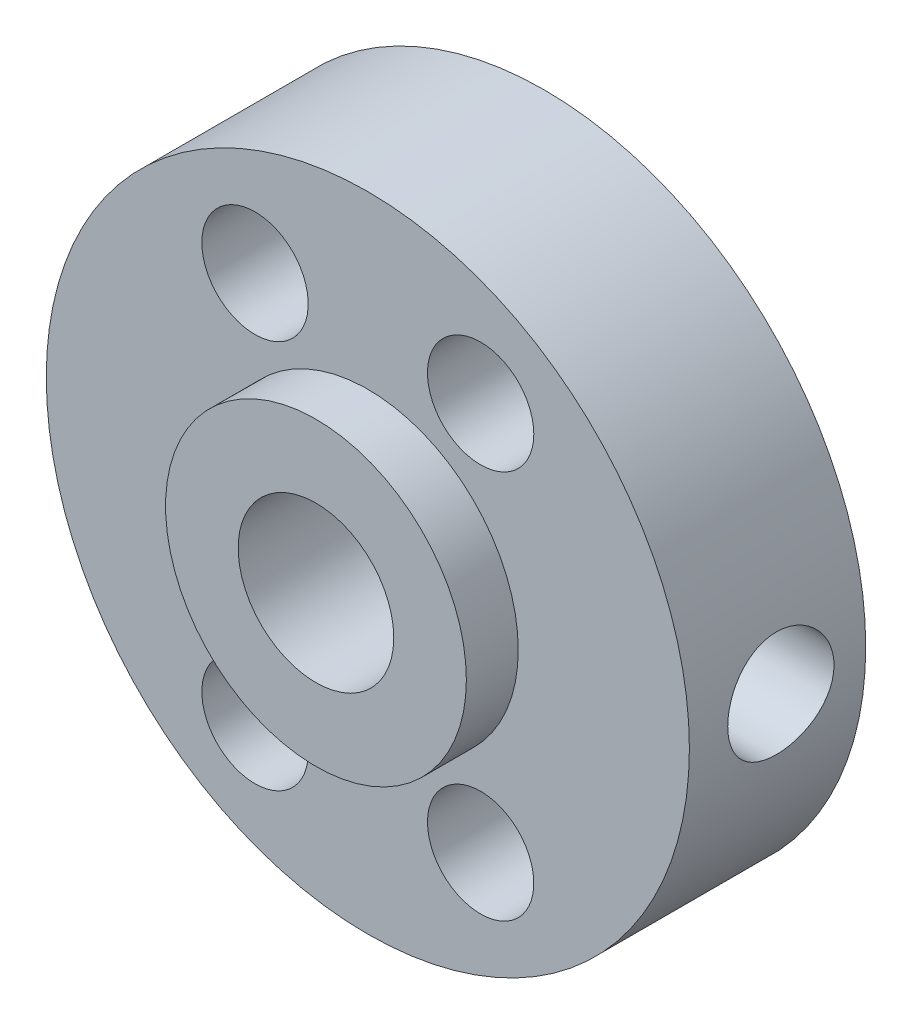
ISO-10303-21;
HEADER;
FILE_DESCRIPTION(('STEP AP214'),'2;1');
FILE_NAME('part.step','',(''),(''),'','','');
FILE_SCHEMA(('AUTOMOTIVE_DESIGN { 1 0 10303 214 1 1 1 1 }'));
ENDSEC;
DATA;
#1=APPLICATION_CONTEXT('core data for automotive mechanical design processes');
#2=APPLICATION_PROTOCOL_DEFINITION('international standard','automotive_design',2000,#1);
#3=PRODUCT_CONTEXT('',#1,'mechanical');
#4=PRODUCT('Part','Part','',(#3));
#5=PRODUCT_RELATED_PRODUCT_CATEGORY('part','',(#4));
#6=PRODUCT_DEFINITION_FORMATION('','',#4);
#7=PRODUCT_DEFINITION_CONTEXT('part definition',#1,'design');
#8=PRODUCT_DEFINITION('design','',#6,#7);
#9=PRODUCT_DEFINITION_SHAPE('','',#8);
#10=(LENGTH_UNIT() NAMED_UNIT(*) SI_UNIT(.MILLI.,.METRE.));
#11=(NAMED_UNIT(*) PLANE_ANGLE_UNIT() SI_UNIT($,.RADIAN.));
#12=(NAMED_UNIT(*) SI_UNIT($,.STERADIAN.) SOLID_ANGLE_UNIT());
#13=UNCERTAINTY_MEASURE_WITH_UNIT(LENGTH_MEASURE(1.E-05),#10,'distance_accuracy_value','');
#14=(GEOMETRIC_REPRESENTATION_CONTEXT(3) GLOBAL_UNCERTAINTY_ASSIGNED_CONTEXT((#13)) GLOBAL_UNIT_ASSIGNED_CONTEXT((#10,
#11,#12)) REPRESENTATION_CONTEXT('',''));
#15=CARTESIAN_POINT('',(0.,0.,0.));
#16=DIRECTION('',(0.,0.,1.));
#17=DIRECTION('',(1.,0.,0.));
#18=AXIS2_PLACEMENT_3D('',#15,#16,#17);
#19=CARTESIAN_POINT('',(0.,0.,6.8));
#20=DIRECTION('',(0.,0.,-1.));
#21=DIRECTION('',(-1.,0.,0.));
#22=AXIS2_PLACEMENT_3D('',#19,#20,#21);
#23=CYLINDRICAL_SURFACE('',#22,12.4);
#24=CARTESIAN_POINT('',(12.4,0.,1.22184954720065));
#25=CARTESIAN_POINT('',(12.399998050443,-0.114314036778196,1.22185414246973));
#26=CARTESIAN_POINT('',(12.3984027557899,-0.228690794208031,1.23144357637989));
#27=CARTESIAN_POINT('',(12.3921924217064,-0.454237318041163,1.26953252137235));
#28=CARTESIAN_POINT('',(12.387574591691,-0.565404021603123,1.29804950784235));
#29=CARTESIAN_POINT('',(12.3758372210875,-0.781234531426579,1.37310977117116));
#30=CARTESIAN_POINT('',(12.3687197142922,-0.885903543128387,1.41963839649673));
#31=CARTESIAN_POINT('',(12.352765909521,-1.0859353317823,1.5293630123131));
#32=CARTESIAN_POINT('',(12.3439298116899,-1.18129919046017,1.59255706227511));
#33=CARTESIAN_POINT('',(12.3254256243051,-1.3609248674729,1.73445153611918));
#34=CARTESIAN_POINT('',(12.3157511528478,-1.44508639022543,1.81327810645098));
#35=CARTESIAN_POINT('',(12.2967095315368,-1.5990520874422,1.98392851046014));
#36=CARTESIAN_POINT('',(12.2873424009643,-1.66885536257417,2.07575315766742));
#37=CARTESIAN_POINT('',(12.2699142193177,-1.79252407375209,2.27048083778905));
#38=CARTESIAN_POINT('',(12.2618614144378,-1.84629051253774,2.37344754482903));
#39=CARTESIAN_POINT('',(12.2480620654671,-1.93572628096881,2.58710627072359));
#40=CARTESIAN_POINT('',(12.2423153681658,-1.9713968128908,2.69779777579318));
#41=CARTESIAN_POINT('',(12.2338423510106,-2.02331259263856,2.922701518779));
#42=CARTESIAN_POINT('',(12.2310891435278,-2.03973087156572,3.03687278290591));
#43=CARTESIAN_POINT('',(12.2288334707887,-2.05321253603465,3.26638034577832));
#44=CARTESIAN_POINT('',(12.2293307791632,-2.05027726937673,3.38171656283681));
#45=CARTESIAN_POINT('',(12.2334953969454,-2.02527614270578,3.60904595563654));
#46=CARTESIAN_POINT('',(12.2371305197029,-2.00340451866634,3.72106116837387));
#47=CARTESIAN_POINT('',(12.247110804365,-1.9414562908201,3.93980988856099));
#48=CARTESIAN_POINT('',(12.253456057853,-1.90137907178891,4.04654321738411));
#49=CARTESIAN_POINT('',(12.2681764882852,-1.80395994226337,4.25228068390589));
#50=CARTESIAN_POINT('',(12.276561128054,-1.74653723857858,4.35124586018611));
#51=CARTESIAN_POINT('',(12.2944090001775,-1.61611453702077,4.53820962318729));
#52=CARTESIAN_POINT('',(12.3038723181907,-1.54311330164702,4.62620733781363));
#53=CARTESIAN_POINT('',(12.3229527607547,-1.38254681521557,4.78986268999639));
#54=CARTESIAN_POINT('',(12.3325703540364,-1.29481488335514,4.86535683365712));
#55=CARTESIAN_POINT('',(12.3507690145153,-1.10784148437952,5.00057680673683));
#56=CARTESIAN_POINT('',(12.3593500752314,-1.00859994530463,5.06030253756179));
#57=CARTESIAN_POINT('',(12.374520720376,-0.801271721941101,5.16230462236197));
#58=CARTESIAN_POINT('',(12.3811086728655,-0.693177880982732,5.20456668754699));
#59=CARTESIAN_POINT('',(12.3915376686622,-0.471293347336676,5.27029085683288));
#60=CARTESIAN_POINT('',(12.3953789380232,-0.35750312428987,5.29375450807448));
#61=CARTESIAN_POINT('',(12.3998514019161,-0.128865239373642,5.32099452336304));
#62=CARTESIAN_POINT('',(12.4005191951496,-0.0140450119002329,5.32499535874957));
#63=CARTESIAN_POINT('',(12.3986696535509,0.214625286484598,5.31379440052258));
#64=CARTESIAN_POINT('',(12.396152439237,0.328475393940509,5.2985933334943));
#65=CARTESIAN_POINT('',(12.3882383789776,0.551281449427157,5.24960677075253));
#66=CARTESIAN_POINT('',(12.3828587352777,0.660262461968227,5.21593225718135));
#67=CARTESIAN_POINT('',(12.3698206553417,0.871032084749591,5.13107290055529));
#68=CARTESIAN_POINT('',(12.3621620928529,0.972820296120155,5.07988708734643));
#69=CARTESIAN_POINT('',(12.3453251274368,1.16729095992994,4.96094294415608));
#70=CARTESIAN_POINT('',(12.3361340732833,1.25988642287329,4.89304421376263));
#71=CARTESIAN_POINT('',(12.3172902387266,1.43244893867809,4.74279496498029));
#72=CARTESIAN_POINT('',(12.3076374253932,1.51241508912941,4.66044341477188));
#73=CARTESIAN_POINT('',(12.2888398567511,1.65827981227583,4.48262005730029));
#74=CARTESIAN_POINT('',(12.2797012769196,1.72402682084344,4.3870231697303));
#75=CARTESIAN_POINT('',(12.26308171798,1.8385288457935,4.18601008202441));
#76=CARTESIAN_POINT('',(12.2556006869469,1.88728439448541,4.08059418963001));
#77=CARTESIAN_POINT('',(12.2431894579483,1.96619213611792,3.86336161832047));
#78=CARTESIAN_POINT('',(12.2382488794594,1.99642013322885,3.75157309440239));
#79=CARTESIAN_POINT('',(12.2314517738418,2.03765348665617,3.52441694612168));
#80=CARTESIAN_POINT('',(12.2295949833171,2.04866048470263,3.40904962829261));
#81=CARTESIAN_POINT('',(12.2291869117896,2.05109417252418,3.17952398351592));
#82=CARTESIAN_POINT('',(12.2305953595638,2.04275940914378,3.06536818723717));
#83=CARTESIAN_POINT('',(12.236470870337,2.00726159430259,2.8401069091439));
#84=CARTESIAN_POINT('',(12.2409379238782,1.9800986010629,2.72900141789826));
#85=CARTESIAN_POINT('',(12.2524121208442,1.90780618333614,2.51308467706871));
#86=CARTESIAN_POINT('',(12.259416405656,1.86269697264918,2.40826649808278));
#87=CARTESIAN_POINT('',(12.2751786864359,1.75581704321785,2.20764725630751));
#88=CARTESIAN_POINT('',(12.2839367670844,1.69404551989969,2.1118466292505));
#89=CARTESIAN_POINT('',(12.3023476487372,1.55474178751414,1.93077613898513));
#90=CARTESIAN_POINT('',(12.3120097023842,1.4770339806686,1.84564229093341));
#91=CARTESIAN_POINT('',(12.3310657719813,1.30843387193498,1.68954075028021));
#92=CARTESIAN_POINT('',(12.3404597255287,1.21753853000852,1.61857633305485));
#93=CARTESIAN_POINT('',(12.3579949182774,1.02441118492357,1.49238884697668));
#94=CARTESIAN_POINT('',(12.366127226402,0.922106454699785,1.4372758373711));
#95=CARTESIAN_POINT('',(12.3801358772801,0.709598940977576,1.34510200742765));
#96=CARTESIAN_POINT('',(12.3860144731818,0.599404177066685,1.30802314743459));
#97=CARTESIAN_POINT('',(12.3935655125747,0.407312940024133,1.26104886695809));
#98=CARTESIAN_POINT('',(12.3959655906275,0.32658058527989,1.24637257326933));
#99=CARTESIAN_POINT('',(12.3991835200485,0.16390955687685,1.22677134763824));
#100=CARTESIAN_POINT('',(12.4000013979644,0.0819709034816462,1.22184625208162));
#101=CARTESIAN_POINT('',(12.4,0.,1.22184954720065));
#102=B_SPLINE_CURVE_WITH_KNOTS('',3,(#24,#25,#26,#27,#28,#29,#30,#31,#32,#33,#34,#35,#36,#37,
#38,#39,#40,#41,#42,#43,#44,#45,#46,#47,#48,#49,#50,#51,#52,#53,#54,#55,#56,#57,#58,#59,#60,#61,
#62,#63,#64,#65,#66,#67,#68,#69,#70,#71,#72,#73,#74,#75,#76,#77,#78,#79,#80,#81,#82,#83,#84,#85,
#86,#87,#88,#89,#90,#91,#92,#93,#94,#95,#96,#97,#98,#99,#100,#101),.UNSPECIFIED.,.T.,.F.,(4,2,2,
2,2,2,2,2,2,2,2,2,2,2,2,2,2,2,2,2,2,2,2,2,2,2,2,2,2,2,2,2,2,2,2,2,2,2,4),(0.,0.342642491024976,
0.685601777112926,1.02828266787725,1.37092367434426,1.71645121307359,2.062000387417,
2.40964051228279,2.75725753721034,3.10172578139107,3.44617003671169,3.78712252556103,
4.12808653712573,4.47066387069979,4.81326842748225,5.16004915025084,5.50683204125874,
5.85389811125856,6.20093561420844,6.54396096787919,6.88697334212266,7.22794723052405,
7.56894001248353,7.91290147066112,8.25688749502233,8.60437681151066,8.95185524085435,
9.29790232746574,9.6439198555876,9.98569258011995,10.3274642478192,10.6688520444766,
11.0102563286928,11.3556467839955,11.7011169868404,12.0489309416249,12.3963962570348,
12.6420982427921,12.8877961059076),.UNSPECIFIED.);
#103=CARTESIAN_POINT('',(12.4,0.,1.22184954720065));
#104=VERTEX_POINT('',#103);
#105=EDGE_CURVE('E10',#104,#104,#102,.T.);
#106=ORIENTED_EDGE('',*,*,#105,.T.);
#107=EDGE_LOOP('',(#106));
#108=FACE_BOUND('',#107,.T.);
#109=CARTESIAN_POINT('',(0.,0.,6.8));
#110=DIRECTION('',(0.,0.,1.));
#111=DIRECTION('',(1.,0.,0.));
#112=AXIS2_PLACEMENT_3D('',#109,#110,#111);
#113=CIRCLE('',#112,12.4);
#114=CARTESIAN_POINT('',(12.4,0.,6.8));
#115=VERTEX_POINT('',#114);
#116=EDGE_CURVE('E58',#115,#115,#113,.T.);
#117=ORIENTED_EDGE('',*,*,#116,.F.);
#118=EDGE_LOOP('',(#117));
#119=FACE_BOUND('',#118,.T.);
#120=CARTESIAN_POINT('',(0.,0.,0.));
#121=DIRECTION('',(0.,0.,1.));
#122=DIRECTION('',(1.,0.,0.));
#123=AXIS2_PLACEMENT_3D('',#120,#121,#122);
#124=CIRCLE('',#123,12.4);
#125=CARTESIAN_POINT('',(12.4,0.,0.));
#126=VERTEX_POINT('',#125);
#127=EDGE_CURVE('E64',#126,#126,#124,.T.);
#128=ORIENTED_EDGE('',*,*,#127,.T.);
#129=EDGE_LOOP('',(#128));
#130=FACE_BOUND('',#129,.T.);
#131=ADVANCED_FACE('F41',(#108,#119,#130),#23,.T.);
#132=CARTESIAN_POINT('',(0.,0.,6.8));
#133=DIRECTION('',(0.,0.,1.));
#134=DIRECTION('',(1.,0.,0.));
#135=AXIS2_PLACEMENT_3D('',#132,#133,#134);
#136=PLANE('',#135);
#137=CARTESIAN_POINT('',(-4.35,7.5,6.8));
#138=DIRECTION('',(0.,0.,1.));
#139=DIRECTION('',(-1.,0.,0.));
#140=AXIS2_PLACEMENT_3D('',#137,#138,#139);
#141=CIRCLE('',#140,2.05);
#142=CARTESIAN_POINT('',(-6.4,7.5,6.8));
#143=VERTEX_POINT('',#142);
#144=EDGE_CURVE('E92',#143,#143,#141,.T.);
#145=ORIENTED_EDGE('',*,*,#144,.F.);
#146=EDGE_LOOP('',(#145));
#147=FACE_BOUND('',#146,.T.);
#148=CARTESIAN_POINT('',(4.35,-7.5,6.8));
#149=DIRECTION('',(0.,0.,1.));
#150=DIRECTION('',(-1.,0.,0.));
#151=AXIS2_PLACEMENT_3D('',#148,#149,#150);
#152=CIRCLE('',#151,2.05);
#153=CARTESIAN_POINT('',(2.3,-7.5,6.8));
#154=VERTEX_POINT('',#153);
#155=EDGE_CURVE('E100',#154,#154,#152,.T.);
#156=ORIENTED_EDGE('',*,*,#155,.F.);
#157=EDGE_LOOP('',(#156));
#158=FACE_BOUND('',#157,.T.);
#159=CARTESIAN_POINT('',(-4.35,-7.5,6.8));
#160=DIRECTION('',(0.,0.,1.));
#161=DIRECTION('',(1.,0.,0.));
#162=AXIS2_PLACEMENT_3D('',#159,#160,#161);
#163=CIRCLE('',#162,2.05);
#164=CARTESIAN_POINT('',(-2.3,-7.5,6.8));
#165=VERTEX_POINT('',#164);
#166=EDGE_CURVE('E101',#165,#165,#163,.T.);
#167=ORIENTED_EDGE('',*,*,#166,.F.);
#168=EDGE_LOOP('',(#167));
#169=FACE_BOUND('',#168,.T.);
#170=CARTESIAN_POINT('',(4.35,7.5,6.8));
#171=DIRECTION('',(0.,0.,1.));
#172=DIRECTION('',(1.,0.,0.));
#173=AXIS2_PLACEMENT_3D('',#170,#171,#172);
#174=CIRCLE('',#173,2.05);
#175=CARTESIAN_POINT('',(6.4,7.5,6.8));
#176=VERTEX_POINT('',#175);
#177=EDGE_CURVE('E88',#176,#176,#174,.T.);
#178=ORIENTED_EDGE('',*,*,#177,.F.);
#179=EDGE_LOOP('',(#178));
#180=FACE_BOUND('',#179,.T.);
#181=CARTESIAN_POINT('',(0.,0.,6.8));
#182=DIRECTION('',(0.,0.,1.));
#183=DIRECTION('',(1.,0.,0.));
#184=AXIS2_PLACEMENT_3D('',#181,#182,#183);
#185=CIRCLE('',#184,5.8);
#186=CARTESIAN_POINT('',(5.8,0.,6.8));
#187=VERTEX_POINT('',#186);
#188=EDGE_CURVE('E53',#187,#187,#185,.T.);
#189=ORIENTED_EDGE('',*,*,#188,.F.);
#190=EDGE_LOOP('',(#189));
#191=FACE_BOUND('',#190,.T.);
#192=ORIENTED_EDGE('',*,*,#116,.T.);
#193=EDGE_LOOP('',(#192));
#194=FACE_BOUND('',#193,.T.);
#195=ADVANCED_FACE('F141',(#147,#158,#169,#180,#191,#194),#136,.T.);
#196=CARTESIAN_POINT('',(0.,0.,0.));
#197=DIRECTION('',(0.,0.,1.));
#198=DIRECTION('',(1.,0.,0.));
#199=AXIS2_PLACEMENT_3D('',#196,#197,#198);
#200=PLANE('',#199);
#201=CARTESIAN_POINT('',(-4.35,7.5,0.));
#202=DIRECTION('',(0.,0.,1.));
#203=DIRECTION('',(-1.,0.,0.));
#204=AXIS2_PLACEMENT_3D('',#201,#202,#203);
#205=CIRCLE('',#204,2.05);
#206=CARTESIAN_POINT('',(-6.4,7.5,0.));
#207=VERTEX_POINT('',#206);
#208=EDGE_CURVE('E105',#207,#207,#205,.T.);
#209=ORIENTED_EDGE('',*,*,#208,.T.);
#210=EDGE_LOOP('',(#209));
#211=FACE_BOUND('',#210,.T.);
#212=CARTESIAN_POINT('',(4.35,-7.5,0.));
#213=DIRECTION('',(0.,0.,1.));
#214=DIRECTION('',(-1.,0.,0.));
#215=AXIS2_PLACEMENT_3D('',#212,#213,#214);
#216=CIRCLE('',#215,2.05);
#217=CARTESIAN_POINT('',(2.3,-7.5,0.));
#218=VERTEX_POINT('',#217);
#219=EDGE_CURVE('E96',#218,#218,#216,.T.);
#220=ORIENTED_EDGE('',*,*,#219,.T.);
#221=EDGE_LOOP('',(#220));
#222=FACE_BOUND('',#221,.T.);
#223=CARTESIAN_POINT('',(-4.35,-7.5,0.));
#224=DIRECTION('',(0.,0.,1.));
#225=DIRECTION('',(1.,0.,0.));
#226=AXIS2_PLACEMENT_3D('',#223,#224,#225);
#227=CIRCLE('',#226,2.05);
#228=CARTESIAN_POINT('',(-2.3,-7.5,0.));
#229=VERTEX_POINT('',#228);
#230=EDGE_CURVE('E112',#229,#229,#227,.T.);
#231=ORIENTED_EDGE('',*,*,#230,.T.);
#232=EDGE_LOOP('',(#231));
#233=FACE_BOUND('',#232,.T.);
#234=CARTESIAN_POINT('',(4.35,7.5,0.));
#235=DIRECTION('',(0.,0.,1.));
#236=DIRECTION('',(1.,0.,0.));
#237=AXIS2_PLACEMENT_3D('',#234,#235,#236);
#238=CIRCLE('',#237,2.05);
#239=CARTESIAN_POINT('',(6.4,7.5,0.));
#240=VERTEX_POINT('',#239);
#241=EDGE_CURVE('E86',#240,#240,#238,.T.);
#242=ORIENTED_EDGE('',*,*,#241,.T.);
#243=EDGE_LOOP('',(#242));
#244=FACE_BOUND('',#243,.T.);
#245=CARTESIAN_POINT('',(0.,0.,0.));
#246=DIRECTION('',(0.,0.,1.));
#247=DIRECTION('',(1.,0.,0.));
#248=AXIS2_PLACEMENT_3D('',#245,#246,#247);
#249=CIRCLE('',#248,3.);
#250=CARTESIAN_POINT('',(3.,0.,0.));
#251=VERTEX_POINT('',#250);
#252=EDGE_CURVE('E75',#251,#251,#249,.T.);
#253=ORIENTED_EDGE('',*,*,#252,.T.);
#254=EDGE_LOOP('',(#253));
#255=FACE_BOUND('',#254,.T.);
#256=ORIENTED_EDGE('',*,*,#127,.F.);
#257=EDGE_LOOP('',(#256));
#258=FACE_BOUND('',#257,.T.);
#259=ADVANCED_FACE('F145',(#211,#222,#233,#244,#255,#258),#200,.F.);
#260=CARTESIAN_POINT('',(0.,0.,8.8));
#261=DIRECTION('',(0.,0.,-1.));
#262=DIRECTION('',(-1.,0.,0.));
#263=AXIS2_PLACEMENT_3D('',#260,#261,#262);
#264=CYLINDRICAL_SURFACE('',#263,5.8);
#265=CARTESIAN_POINT('',(0.,0.,8.8));
#266=DIRECTION('',(0.,0.,1.));
#267=DIRECTION('',(1.,0.,0.));
#268=AXIS2_PLACEMENT_3D('',#265,#266,#267);
#269=CIRCLE('',#268,5.8);
#270=CARTESIAN_POINT('',(5.8,0.,8.8));
#271=VERTEX_POINT('',#270);
#272=EDGE_CURVE('E67',#271,#271,#269,.T.);
#273=ORIENTED_EDGE('',*,*,#272,.F.);
#274=EDGE_LOOP('',(#273));
#275=FACE_BOUND('',#274,.T.);
#276=ORIENTED_EDGE('',*,*,#188,.T.);
#277=EDGE_LOOP('',(#276));
#278=FACE_BOUND('',#277,.T.);
#279=ADVANCED_FACE('F154',(#275,#278),#264,.T.);
#280=CARTESIAN_POINT('',(0.,0.,8.8));
#281=DIRECTION('',(0.,0.,1.));
#282=DIRECTION('',(1.,0.,0.));
#283=AXIS2_PLACEMENT_3D('',#280,#281,#282);
#284=PLANE('',#283);
#285=CARTESIAN_POINT('',(0.,0.,8.8));
#286=DIRECTION('',(0.,0.,1.));
#287=DIRECTION('',(1.,0.,0.));
#288=AXIS2_PLACEMENT_3D('',#285,#286,#287);
#289=CIRCLE('',#288,3.);
#290=CARTESIAN_POINT('',(3.,0.,8.8));
#291=VERTEX_POINT('',#290);
#292=EDGE_CURVE('E80',#291,#291,#289,.T.);
#293=ORIENTED_EDGE('',*,*,#292,.F.);
#294=EDGE_LOOP('',(#293));
#295=FACE_BOUND('',#294,.T.);
#296=ORIENTED_EDGE('',*,*,#272,.T.);
#297=EDGE_LOOP('',(#296));
#298=FACE_BOUND('',#297,.T.);
#299=ADVANCED_FACE('F161',(#295,#298),#284,.T.);
#300=CARTESIAN_POINT('',(0.,0.,0.));
#301=DIRECTION('',(0.,0.,1.));
#302=DIRECTION('',(1.,0.,0.));
#303=AXIS2_PLACEMENT_3D('',#300,#301,#302);
#304=CYLINDRICAL_SURFACE('',#303,3.);
#305=ORIENTED_EDGE('',*,*,#252,.F.);
#306=EDGE_LOOP('',(#305));
#307=FACE_BOUND('',#306,.T.);
#308=ORIENTED_EDGE('',*,*,#292,.T.);
#309=EDGE_LOOP('',(#308));
#310=FACE_BOUND('',#309,.T.);
#311=ADVANCED_FACE('F165',(#307,#310),#304,.F.);
#312=CARTESIAN_POINT('',(4.35,7.5,0.));
#313=DIRECTION('',(0.,0.,1.));
#314=DIRECTION('',(1.,0.,0.));
#315=AXIS2_PLACEMENT_3D('',#312,#313,#314);
#316=CYLINDRICAL_SURFACE('',#315,2.05);
#317=ORIENTED_EDGE('',*,*,#241,.F.);
#318=EDGE_LOOP('',(#317));
#319=FACE_BOUND('',#318,.T.);
#320=ORIENTED_EDGE('',*,*,#177,.T.);
#321=EDGE_LOOP('',(#320));
#322=FACE_BOUND('',#321,.T.);
#323=ADVANCED_FACE('F169',(#319,#322),#316,.F.);
#324=CARTESIAN_POINT('',(-4.35,-7.5,0.));
#325=DIRECTION('',(0.,0.,1.));
#326=DIRECTION('',(1.,0.,0.));
#327=AXIS2_PLACEMENT_3D('',#324,#325,#326);
#328=CYLINDRICAL_SURFACE('',#327,2.05);
#329=ORIENTED_EDGE('',*,*,#230,.F.);
#330=EDGE_LOOP('',(#329));
#331=FACE_BOUND('',#330,.T.);
#332=ORIENTED_EDGE('',*,*,#166,.T.);
#333=EDGE_LOOP('',(#332));
#334=FACE_BOUND('',#333,.T.);
#335=ADVANCED_FACE('F173',(#331,#334),#328,.F.);
#336=CARTESIAN_POINT('',(4.35,-7.5,0.));
#337=DIRECTION('',(0.,0.,1.));
#338=DIRECTION('',(1.,0.,0.));
#339=AXIS2_PLACEMENT_3D('',#336,#337,#338);
#340=CYLINDRICAL_SURFACE('',#339,2.05);
#341=ORIENTED_EDGE('',*,*,#219,.F.);
#342=EDGE_LOOP('',(#341));
#343=FACE_BOUND('',#342,.T.);
#344=ORIENTED_EDGE('',*,*,#155,.T.);
#345=EDGE_LOOP('',(#344));
#346=FACE_BOUND('',#345,.T.);
#347=ADVANCED_FACE('F135',(#343,#346),#340,.F.);
#348=CARTESIAN_POINT('',(-4.35,7.5,0.));
#349=DIRECTION('',(0.,0.,1.));
#350=DIRECTION('',(1.,0.,0.));
#351=AXIS2_PLACEMENT_3D('',#348,#349,#350);
#352=CYLINDRICAL_SURFACE('',#351,2.05);
#353=ORIENTED_EDGE('',*,*,#208,.F.);
#354=EDGE_LOOP('',(#353));
#355=FACE_BOUND('',#354,.T.);
#356=ORIENTED_EDGE('',*,*,#144,.T.);
#357=EDGE_LOOP('',(#356));
#358=FACE_BOUND('',#357,.T.);
#359=ADVANCED_FACE('F129',(#355,#358),#352,.F.);
#360=CARTESIAN_POINT('',(6.4,0.,3.27184954720065));
#361=DIRECTION('',(1.,0.,0.));
#362=DIRECTION('',(0.,0.,-1.));
#363=AXIS2_PLACEMENT_3D('',#360,#361,#362);
#364=CYLINDRICAL_SURFACE('',#363,2.05);
#365=CARTESIAN_POINT('',(6.4,0.,3.27184954720065));
#366=DIRECTION('',(1.,0.,0.));
#367=DIRECTION('',(0.,0.,-1.));
#368=AXIS2_PLACEMENT_3D('',#365,#366,#367);
#369=CIRCLE('',#368,2.05);
#370=CARTESIAN_POINT('',(6.4,0.,1.22184954720065));
#371=VERTEX_POINT('',#370);
#372=EDGE_CURVE('E116',#371,#371,#369,.T.);
#373=ORIENTED_EDGE('',*,*,#372,.F.);
#374=EDGE_LOOP('',(#373));
#375=FACE_BOUND('',#374,.T.);
#376=ORIENTED_EDGE('',*,*,#105,.F.);
#377=EDGE_LOOP('',(#376));
#378=FACE_BOUND('',#377,.T.);
#379=ADVANCED_FACE('F126',(#375,#378),#364,.F.);
#380=CARTESIAN_POINT('',(6.4,0.,3.27184954720065));
#381=DIRECTION('',(1.,0.,0.));
#382=DIRECTION('',(0.,0.,-1.));
#383=AXIS2_PLACEMENT_3D('',#380,#381,#382);
#384=PLANE('',#383);
#385=ORIENTED_EDGE('',*,*,#372,.T.);
#386=EDGE_LOOP('',(#385));
#387=FACE_BOUND('',#386,.T.);
#388=ADVANCED_FACE('F124',(#387),#384,.T.);
#389=CLOSED_SHELL('',(#131,#195,#259,#279,#299,#311,#323,#335,#347,#359,#379,#388));
#390=MANIFOLD_SOLID_BREP('B2',#389);
#391=ADVANCED_BREP_SHAPE_REPRESENTATION('',(#18,#390),#14);
#392=SHAPE_DEFINITION_REPRESENTATION(#9,#391);
ENDSEC;
END-ISO-10303-21;
